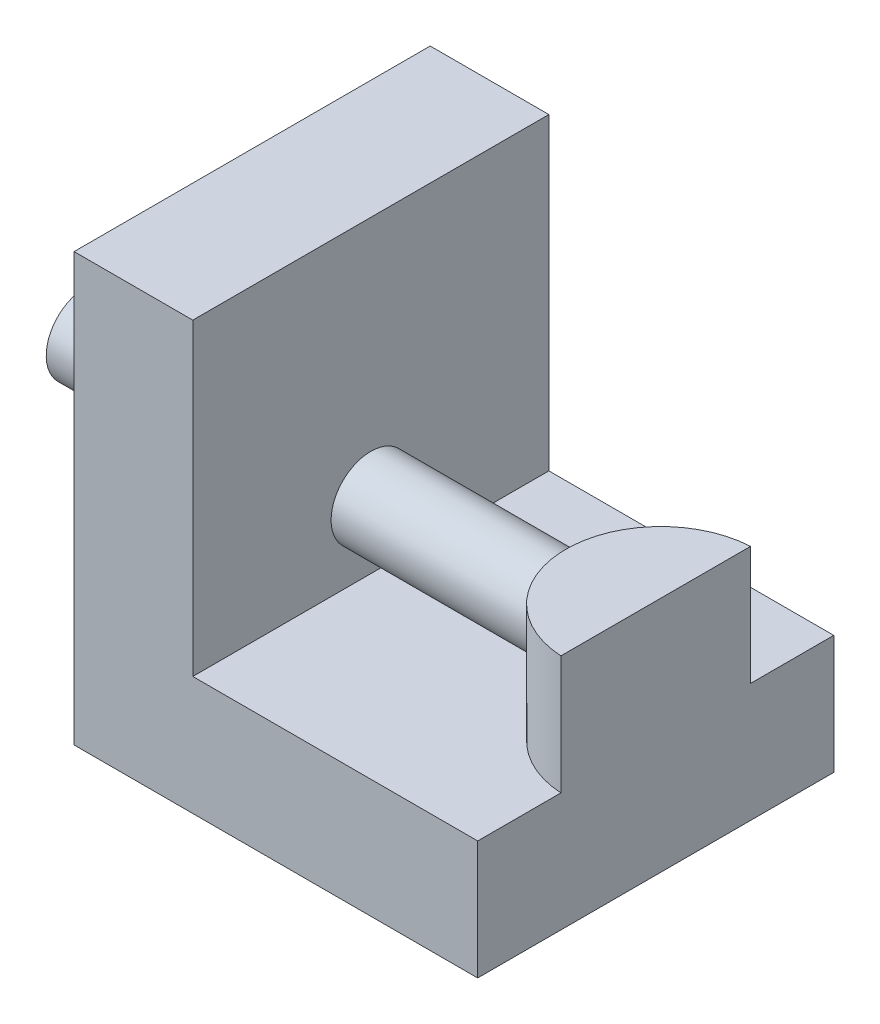
ISO-10303-21;
HEADER;
FILE_DESCRIPTION(('STEP AP214'),'2;1');
FILE_NAME('part.step','',(''),(''),'','','');
FILE_SCHEMA(('AUTOMOTIVE_DESIGN { 1 0 10303 214 1 1 1 1 }'));
ENDSEC;
DATA;
#1=APPLICATION_CONTEXT('core data for automotive mechanical design processes');
#2=APPLICATION_PROTOCOL_DEFINITION('international standard','automotive_design',2000,#1);
#3=PRODUCT_CONTEXT('',#1,'mechanical');
#4=PRODUCT('Part','Part','',(#3));
#5=PRODUCT_RELATED_PRODUCT_CATEGORY('part','',(#4));
#6=PRODUCT_DEFINITION_FORMATION('','',#4);
#7=PRODUCT_DEFINITION_CONTEXT('part definition',#1,'design');
#8=PRODUCT_DEFINITION('design','',#6,#7);
#9=PRODUCT_DEFINITION_SHAPE('','',#8);
#10=(LENGTH_UNIT() NAMED_UNIT(*) SI_UNIT(.MILLI.,.METRE.));
#11=(NAMED_UNIT(*) PLANE_ANGLE_UNIT() SI_UNIT($,.RADIAN.));
#12=(NAMED_UNIT(*) SI_UNIT($,.STERADIAN.) SOLID_ANGLE_UNIT());
#13=UNCERTAINTY_MEASURE_WITH_UNIT(LENGTH_MEASURE(1.E-05),#10,'distance_accuracy_value','');
#14=(GEOMETRIC_REPRESENTATION_CONTEXT(3) GLOBAL_UNCERTAINTY_ASSIGNED_CONTEXT((#13)) GLOBAL_UNIT_ASSIGNED_CONTEXT((#10,
#11,#12)) REPRESENTATION_CONTEXT('',''));
#15=CARTESIAN_POINT('',(0.,0.,0.));
#16=DIRECTION('',(0.,0.,1.));
#17=DIRECTION('',(1.,0.,0.));
#18=AXIS2_PLACEMENT_3D('',#15,#16,#17);
#19=CARTESIAN_POINT('',(10.,0.,15.));
#20=DIRECTION('',(0.,-1.,0.));
#21=DIRECTION('',(1.,0.,0.));
#22=AXIS2_PLACEMENT_3D('',#19,#20,#21);
#23=PLANE('',#22);
#24=DIRECTION('',(-1.,0.,0.));
#25=VECTOR('',#24,1.);
#26=CARTESIAN_POINT('',(10.,0.,-15.));
#27=LINE('',#26,#25);
#28=CARTESIAN_POINT('',(10.,0.,-15.));
#29=VERTEX_POINT('',#28);
#30=CARTESIAN_POINT('',(0.,0.,-15.));
#31=VERTEX_POINT('',#30);
#32=EDGE_CURVE('E143',#29,#31,#27,.T.);
#33=ORIENTED_EDGE('',*,*,#32,.T.);
#34=DIRECTION('',(0.,0.,-1.));
#35=VECTOR('',#34,1.);
#36=CARTESIAN_POINT('',(0.,0.,15.));
#37=LINE('',#36,#35);
#38=CARTESIAN_POINT('',(0.,0.,15.));
#39=VERTEX_POINT('',#38);
#40=EDGE_CURVE('E158',#39,#31,#37,.T.);
#41=ORIENTED_EDGE('',*,*,#40,.F.);
#42=DIRECTION('',(-1.,0.,0.));
#43=VECTOR('',#42,1.);
#44=CARTESIAN_POINT('',(10.,0.,15.));
#45=LINE('',#44,#43);
#46=CARTESIAN_POINT('',(10.,0.,15.));
#47=VERTEX_POINT('',#46);
#48=EDGE_CURVE('E137',#47,#39,#45,.T.);
#49=ORIENTED_EDGE('',*,*,#48,.F.);
#50=DIRECTION('',(0.,0.,-1.));
#51=VECTOR('',#50,1.);
#52=CARTESIAN_POINT('',(10.,0.,15.));
#53=LINE('',#52,#51);
#54=EDGE_CURVE('E142',#47,#29,#53,.T.);
#55=ORIENTED_EDGE('',*,*,#54,.T.);
#56=EDGE_LOOP('',(#33,#41,#49,#55));
#57=FACE_BOUND('',#56,.T.);
#58=ADVANCED_FACE('F41',(#57),#23,.F.);
#59=CARTESIAN_POINT('',(0.,0.,15.));
#60=DIRECTION('',(1.,0.,0.));
#61=DIRECTION('',(0.,0.,-1.));
#62=AXIS2_PLACEMENT_3D('',#59,#60,#61);
#63=PLANE('',#62);
#64=CARTESIAN_POINT('',(0.,-20.4235898195642,0.));
#65=DIRECTION('',(1.,0.,0.));
#66=DIRECTION('',(0.,0.,-1.));
#67=AXIS2_PLACEMENT_3D('',#64,#65,#66);
#68=CIRCLE('',#67,3.34939061710744);
#69=CARTESIAN_POINT('',(0.,-20.4235898195642,-3.34939061710744));
#70=VERTEX_POINT('',#69);
#71=EDGE_CURVE('E131',#70,#70,#68,.T.);
#72=ORIENTED_EDGE('',*,*,#71,.T.);
#73=EDGE_LOOP('',(#72));
#74=FACE_BOUND('',#73,.T.);
#75=DIRECTION('',(0.,-1.,0.));
#76=VECTOR('',#75,1.);
#77=CARTESIAN_POINT('',(0.,0.,-15.));
#78=LINE('',#77,#76);
#79=CARTESIAN_POINT('',(0.,-36.,-15.));
#80=VERTEX_POINT('',#79);
#81=EDGE_CURVE('E146',#31,#80,#78,.T.);
#82=ORIENTED_EDGE('',*,*,#81,.T.);
#83=DIRECTION('',(0.,0.,-1.));
#84=VECTOR('',#83,1.);
#85=CARTESIAN_POINT('',(0.,-36.,15.));
#86=LINE('',#85,#84);
#87=CARTESIAN_POINT('',(0.,-36.,15.));
#88=VERTEX_POINT('',#87);
#89=EDGE_CURVE('E156',#88,#80,#86,.T.);
#90=ORIENTED_EDGE('',*,*,#89,.F.);
#91=DIRECTION('',(0.,-1.,0.));
#92=VECTOR('',#91,1.);
#93=CARTESIAN_POINT('',(0.,0.,15.));
#94=LINE('',#93,#92);
#95=EDGE_CURVE('E92',#39,#88,#94,.T.);
#96=ORIENTED_EDGE('',*,*,#95,.F.);
#97=ORIENTED_EDGE('',*,*,#40,.T.);
#98=EDGE_LOOP('',(#82,#90,#96,#97));
#99=FACE_BOUND('',#98,.T.);
#100=ADVANCED_FACE('F181',(#74,#99),#63,.F.);
#101=CARTESIAN_POINT('',(0.,-36.,15.));
#102=DIRECTION('',(0.,1.,0.));
#103=DIRECTION('',(0.,0.,1.));
#104=AXIS2_PLACEMENT_3D('',#101,#102,#103);
#105=PLANE('',#104);
#106=DIRECTION('',(1.,0.,0.));
#107=VECTOR('',#106,1.);
#108=CARTESIAN_POINT('',(0.,-36.,-15.));
#109=LINE('',#108,#107);
#110=CARTESIAN_POINT('',(34.0028756214869,-36.,-15.));
#111=VERTEX_POINT('',#110);
#112=EDGE_CURVE('E130',#80,#111,#109,.T.);
#113=ORIENTED_EDGE('',*,*,#112,.T.);
#114=DIRECTION('',(0.,0.,1.));
#115=VECTOR('',#114,1.);
#116=CARTESIAN_POINT('',(34.0028756214869,-36.,-15.));
#117=LINE('',#116,#115);
#118=CARTESIAN_POINT('',(34.0028756214869,-36.,15.));
#119=VERTEX_POINT('',#118);
#120=EDGE_CURVE('E115',#111,#119,#117,.T.);
#121=ORIENTED_EDGE('',*,*,#120,.T.);
#122=DIRECTION('',(1.,0.,0.));
#123=VECTOR('',#122,1.);
#124=CARTESIAN_POINT('',(0.,-36.,15.));
#125=LINE('',#124,#123);
#126=EDGE_CURVE('E128',#88,#119,#125,.T.);
#127=ORIENTED_EDGE('',*,*,#126,.F.);
#128=ORIENTED_EDGE('',*,*,#89,.T.);
#129=EDGE_LOOP('',(#113,#121,#127,#128));
#130=FACE_BOUND('',#129,.T.);
#131=ADVANCED_FACE('F126',(#130),#105,.F.);
#132=CARTESIAN_POINT('',(60.,-26.,15.));
#133=DIRECTION('',(0.,-1.,0.));
#134=DIRECTION('',(1.,0.,0.));
#135=AXIS2_PLACEMENT_3D('',#132,#133,#134);
#136=PLANE('',#135);
#137=DIRECTION('',(-1.,0.,0.));
#138=VECTOR('',#137,1.);
#139=CARTESIAN_POINT('',(60.,-26.,15.));
#140=LINE('',#139,#138);
#141=CARTESIAN_POINT('',(34.0028756214869,-26.,15.));
#142=VERTEX_POINT('',#141);
#143=CARTESIAN_POINT('',(10.,-26.,15.));
#144=VERTEX_POINT('',#143);
#145=EDGE_CURVE('E134',#142,#144,#140,.T.);
#146=ORIENTED_EDGE('',*,*,#145,.F.);
#147=DIRECTION('',(0.,0.,-1.));
#148=VECTOR('',#147,1.);
#149=CARTESIAN_POINT('',(34.0028756214869,-26.,15.));
#150=LINE('',#149,#148);
#151=CARTESIAN_POINT('',(34.0028756214869,-26.,7.98849562483435));
#152=VERTEX_POINT('',#151);
#153=EDGE_CURVE('E118',#142,#152,#150,.T.);
#154=ORIENTED_EDGE('',*,*,#153,.T.);
#155=CARTESIAN_POINT('',(34.4317551523605,-26.,0.));
#156=DIRECTION('',(0.,-1.,0.));
#157=DIRECTION('',(1.,0.,0.));
#158=AXIS2_PLACEMENT_3D('',#155,#156,#157);
#159=CIRCLE('',#158,8.);
#160=CARTESIAN_POINT('',(34.0028756214869,-26.,-7.98849562483435));
#161=VERTEX_POINT('',#160);
#162=EDGE_CURVE('E48',#161,#152,#159,.F.);
#163=ORIENTED_EDGE('',*,*,#162,.F.);
#164=CARTESIAN_POINT('',(34.0028756214869,-26.,-15.));
#165=VERTEX_POINT('',#164);
#166=EDGE_CURVE('E170',#161,#165,#150,.T.);
#167=ORIENTED_EDGE('',*,*,#166,.T.);
#168=DIRECTION('',(-1.,0.,0.));
#169=VECTOR('',#168,1.);
#170=CARTESIAN_POINT('',(60.,-26.,-15.));
#171=LINE('',#170,#169);
#172=CARTESIAN_POINT('',(10.,-26.,-15.));
#173=VERTEX_POINT('',#172);
#174=EDGE_CURVE('E150',#165,#173,#171,.T.);
#175=ORIENTED_EDGE('',*,*,#174,.T.);
#176=DIRECTION('',(0.,0.,-1.));
#177=VECTOR('',#176,1.);
#178=CARTESIAN_POINT('',(10.,-26.,15.));
#179=LINE('',#178,#177);
#180=EDGE_CURVE('E154',#144,#173,#179,.T.);
#181=ORIENTED_EDGE('',*,*,#180,.F.);
#182=EDGE_LOOP('',(#146,#154,#163,#167,#175,#181));
#183=FACE_BOUND('',#182,.T.);
#184=ADVANCED_FACE('F169',(#183),#136,.F.);
#185=CARTESIAN_POINT('',(10.,-26.,15.));
#186=DIRECTION('',(-1.,0.,0.));
#187=DIRECTION('',(0.,-1.,0.));
#188=AXIS2_PLACEMENT_3D('',#185,#186,#187);
#189=PLANE('',#188);
#190=CARTESIAN_POINT('',(10.,-20.4235898195642,0.));
#191=DIRECTION('',(-1.,0.,0.));
#192=DIRECTION('',(0.,-1.,0.));
#193=AXIS2_PLACEMENT_3D('',#190,#191,#192);
#194=CIRCLE('',#193,3.34939061710744);
#195=CARTESIAN_POINT('',(10.,-23.7729804366716,0.));
#196=VERTEX_POINT('',#195);
#197=EDGE_CURVE('E188',#196,#196,#194,.T.);
#198=ORIENTED_EDGE('',*,*,#197,.T.);
#199=EDGE_LOOP('',(#198));
#200=FACE_BOUND('',#199,.T.);
#201=DIRECTION('',(0.,1.,0.));
#202=VECTOR('',#201,1.);
#203=CARTESIAN_POINT('',(10.,-26.,-15.));
#204=LINE('',#203,#202);
#205=EDGE_CURVE('E84',#173,#29,#204,.T.);
#206=ORIENTED_EDGE('',*,*,#205,.T.);
#207=ORIENTED_EDGE('',*,*,#54,.F.);
#208=DIRECTION('',(0.,1.,0.));
#209=VECTOR('',#208,1.);
#210=CARTESIAN_POINT('',(10.,-26.,15.));
#211=LINE('',#210,#209);
#212=EDGE_CURVE('E63',#144,#47,#211,.T.);
#213=ORIENTED_EDGE('',*,*,#212,.F.);
#214=ORIENTED_EDGE('',*,*,#180,.T.);
#215=EDGE_LOOP('',(#206,#207,#213,#214));
#216=FACE_BOUND('',#215,.T.);
#217=ADVANCED_FACE('F231',(#200,#216),#189,.F.);
#218=CARTESIAN_POINT('',(0.,0.,15.));
#219=DIRECTION('',(0.,0.,1.));
#220=DIRECTION('',(1.,0.,0.));
#221=AXIS2_PLACEMENT_3D('',#218,#219,#220);
#222=PLANE('',#221);
#223=DIRECTION('',(0.,1.,0.));
#224=VECTOR('',#223,1.);
#225=CARTESIAN_POINT('',(34.0028756214869,-36.,15.));
#226=LINE('',#225,#224);
#227=EDGE_CURVE('E112',#119,#142,#226,.T.);
#228=ORIENTED_EDGE('',*,*,#227,.T.);
#229=ORIENTED_EDGE('',*,*,#145,.T.);
#230=ORIENTED_EDGE('',*,*,#212,.T.);
#231=ORIENTED_EDGE('',*,*,#48,.T.);
#232=ORIENTED_EDGE('',*,*,#95,.T.);
#233=ORIENTED_EDGE('',*,*,#126,.T.);
#234=EDGE_LOOP('',(#228,#229,#230,#231,#232,#233));
#235=FACE_BOUND('',#234,.T.);
#236=ADVANCED_FACE('F133',(#235),#222,.T.);
#237=CARTESIAN_POINT('',(0.,0.,-15.));
#238=DIRECTION('',(0.,0.,1.));
#239=DIRECTION('',(1.,0.,0.));
#240=AXIS2_PLACEMENT_3D('',#237,#238,#239);
#241=PLANE('',#240);
#242=ORIENTED_EDGE('',*,*,#174,.F.);
#243=DIRECTION('',(0.,1.,0.));
#244=VECTOR('',#243,1.);
#245=CARTESIAN_POINT('',(34.0028756214869,-36.,-15.));
#246=LINE('',#245,#244);
#247=EDGE_CURVE('E121',#111,#165,#246,.T.);
#248=ORIENTED_EDGE('',*,*,#247,.F.);
#249=ORIENTED_EDGE('',*,*,#112,.F.);
#250=ORIENTED_EDGE('',*,*,#81,.F.);
#251=ORIENTED_EDGE('',*,*,#32,.F.);
#252=ORIENTED_EDGE('',*,*,#205,.F.);
#253=EDGE_LOOP('',(#242,#248,#249,#250,#251,#252));
#254=FACE_BOUND('',#253,.T.);
#255=ADVANCED_FACE('F183',(#254),#241,.F.);
#256=CARTESIAN_POINT('',(34.4317551523605,-16.,0.));
#257=DIRECTION('',(0.,-1.,0.));
#258=DIRECTION('',(1.,0.,0.));
#259=AXIS2_PLACEMENT_3D('',#256,#257,#258);
#260=CYLINDRICAL_SURFACE('',#259,8.);
#261=CARTESIAN_POINT('',(26.4317551523605,-17.0741992024567,0.));
#262=CARTESIAN_POINT('',(26.4317558817988,-17.0742001925388,0.0897078127797531));
#263=CARTESIAN_POINT('',(26.4332697400993,-17.0778105669251,0.17944977003199));
#264=CARTESIAN_POINT('',(26.4392788678862,-17.0922045543725,0.35827139459629));
#265=CARTESIAN_POINT('',(26.443776011113,-17.1029926756425,0.447350610074309));
#266=CARTESIAN_POINT('',(26.4616182759959,-17.1460527800052,0.712944928938162));
#267=CARTESIAN_POINT('',(26.4793138087965,-17.1890201788916,0.887573114557001));
#268=CARTESIAN_POINT('',(26.5243947874883,-17.3015109309302,1.22588125103088));
#269=CARTESIAN_POINT('',(26.5517472557409,-17.3709439695709,1.38959623536702));
#270=CARTESIAN_POINT('',(26.6134746962865,-17.5340199859777,1.70293392598224));
#271=CARTESIAN_POINT('',(26.6478475785189,-17.6276557605,1.85256080713196));
#272=CARTESIAN_POINT('',(26.7221270010987,-17.8414815930732,2.14123413851876));
#273=CARTESIAN_POINT('',(26.762215902194,-17.9626991505073,2.27947165123353));
#274=CARTESIAN_POINT('',(26.8426222512165,-18.2260745560622,2.53435470737511));
#275=CARTESIAN_POINT('',(26.8829398089089,-18.3682434569073,2.65098878032265));
#276=CARTESIAN_POINT('',(26.9614858466184,-18.6780648792498,2.86509038356292));
#277=CARTESIAN_POINT('',(26.9995103662429,-18.8466337802149,2.96131448979058));
#278=CARTESIAN_POINT('',(27.0662696099118,-19.1993866345087,3.12368157207278));
#279=CARTESIAN_POINT('',(27.0950091630204,-19.3835624076593,3.18984019233904));
#280=CARTESIAN_POINT('',(27.1379690140483,-19.7529951491295,3.28685135135143));
#281=CARTESIAN_POINT('',(27.1528259158831,-19.9377664154364,3.31926066921861));
#282=CARTESIAN_POINT('',(27.1681668491843,-20.3106757985118,3.35270932232995));
#283=CARTESIAN_POINT('',(27.1686589173742,-20.4988119737481,3.35376619839562));
#284=CARTESIAN_POINT('',(27.1557528266048,-20.8575343576752,3.32565168307137));
#285=CARTESIAN_POINT('',(27.1434287803555,-21.0283502117384,3.29881788725265));
#286=CARTESIAN_POINT('',(27.108095727197,-21.3627850525175,3.21960761707694));
#287=CARTESIAN_POINT('',(27.0850846507318,-21.5264026385591,3.16722619529389));
#288=CARTESIAN_POINT('',(27.0304491959267,-21.8459488359237,3.03738428541276));
#289=CARTESIAN_POINT('',(26.9986512113858,-22.0016383200194,2.95941163366398));
#290=CARTESIAN_POINT('',(26.9300642240295,-22.2983326312061,2.78096311010722));
#291=CARTESIAN_POINT('',(26.8932732445743,-22.4393316033025,2.6804783158286));
#292=CARTESIAN_POINT('',(26.815023499484,-22.7153169800342,2.44978451019657));
#293=CARTESIAN_POINT('',(26.7734344373312,-22.8487613985906,2.31776982527865));
#294=CARTESIAN_POINT('',(26.6929233541248,-23.0921374660822,2.03282720016631));
#295=CARTESIAN_POINT('',(26.6540019713549,-23.2020635011343,1.87989428099903));
#296=CARTESIAN_POINT('',(26.5820616266107,-23.3975735149856,1.55273191159095));
#297=CARTESIAN_POINT('',(26.5492029330737,-23.4825244922825,1.37808632743886));
#298=CARTESIAN_POINT('',(26.4943227400624,-23.621298314138,1.0152557622637));
#299=CARTESIAN_POINT('',(26.4722951928913,-23.6751385326998,0.827078404302713));
#300=CARTESIAN_POINT('',(26.4426923266028,-23.7469216916627,0.455407187604107));
#301=CARTESIAN_POINT('',(26.4342854528807,-23.7669336411897,0.272379099880391));
#302=CARTESIAN_POINT('',(26.4302125689918,-23.7766677322842,-0.0945983537981081));
#303=CARTESIAN_POINT('',(26.4345428558972,-23.7663986770968,-0.2785474364808));
#304=CARTESIAN_POINT('',(26.4549191245146,-23.7173383328191,-0.632417932511072));
#305=CARTESIAN_POINT('',(26.4703659246182,-23.6800050818177,-0.802579924169701));
#306=CARTESIAN_POINT('',(26.5107793893392,-23.5799109248268,-1.13403627632087));
#307=CARTESIAN_POINT('',(26.5357472537752,-23.517146814047,-1.29532951626513));
#308=CARTESIAN_POINT('',(26.593777404959,-23.3659236714714,-1.61013446341021));
#309=CARTESIAN_POINT('',(26.6270672929311,-23.2767261875408,-1.76324812276608));
#310=CARTESIAN_POINT('',(26.6981953073113,-23.0759790161269,-2.05288320423365));
#311=CARTESIAN_POINT('',(26.7360353378966,-22.9644199574901,-2.18939763137508));
#312=CARTESIAN_POINT('',(26.8155632927109,-22.7127054704125,-2.45231037316896));
#313=CARTESIAN_POINT('',(26.8573319019693,-22.5710678617804,-2.57726891544397));
#314=CARTESIAN_POINT('',(26.9375715357592,-22.2681767696774,-2.80205140625325));
#315=CARTESIAN_POINT('',(26.9760417829382,-22.1069186836286,-2.9018694403947));
#316=CARTESIAN_POINT('',(27.0456042645346,-21.7659193573367,-3.07467374348574));
#317=CARTESIAN_POINT('',(27.0765785276364,-21.585939325015,-3.14723981342553));
#318=CARTESIAN_POINT('',(27.1260321162576,-21.2146089749996,-3.26041350211892));
#319=CARTESIAN_POINT('',(27.1445218773299,-21.0232682993757,-3.30104781667359));
#320=CARTESIAN_POINT('',(27.1653088587262,-20.650640046463,-3.34653944645754));
#321=CARTESIAN_POINT('',(27.1687508431016,-20.4697239134726,-3.3539274018473));
#322=CARTESIAN_POINT('',(27.1620990315104,-20.1093340998214,-3.33948583971582));
#323=CARTESIAN_POINT('',(27.1520073622613,-19.9298601969825,-3.31766091279254));
#324=CARTESIAN_POINT('',(27.1204759561348,-19.5862299243544,-3.24754585216849));
#325=CARTESIAN_POINT('',(27.0995974520697,-19.4217508299166,-3.20056073711527));
#326=CARTESIAN_POINT('',(27.0492903123863,-19.1029761096712,-3.08274122065387));
#327=CARTESIAN_POINT('',(27.0198592697859,-18.9486833656793,-3.01190010444373));
#328=CARTESIAN_POINT('',(26.953557755093,-18.644479135714,-2.84345192987509));
#329=CARTESIAN_POINT('',(26.9163451103826,-18.49539634989,-2.74448570951738));
#330=CARTESIAN_POINT('',(26.8396179740621,-18.2151599005261,-2.52448164410009));
#331=CARTESIAN_POINT('',(26.8001026753137,-18.084012578388,-2.40343602759855));
#332=CARTESIAN_POINT('',(26.7197215582408,-17.8334159656872,-2.13213428875183));
#333=CARTESIAN_POINT('',(26.6789714509354,-17.7155453958333,-1.98038128987496));
#334=CARTESIAN_POINT('',(26.6036264170432,-17.5068229215503,-1.65763569088373));
#335=CARTESIAN_POINT('',(26.5690342941532,-17.4159833115942,-1.48663438466082));
#336=CARTESIAN_POINT('',(26.5249507926865,-17.3031541227055,-1.22082506503175));
#337=CARTESIAN_POINT('',(26.5116302044379,-17.2696194637571,-1.13139141668865));
#338=CARTESIAN_POINT('',(26.4877941664912,-17.2102300809608,-0.949660603185164));
#339=CARTESIAN_POINT('',(26.4772773850246,-17.1843717103194,-0.85736482083741));
#340=CARTESIAN_POINT('',(26.459382519387,-17.1406737946855,-0.670848642616789));
#341=CARTESIAN_POINT('',(26.4519967031024,-17.1228144892535,-0.576633597343808));
#342=CARTESIAN_POINT('',(26.4405502917185,-17.095237072445,-0.386865739313124));
#343=CARTESIAN_POINT('',(26.4364872651262,-17.0855130078839,-0.291313956902217));
#344=CARTESIAN_POINT('',(26.4333488369869,-17.0780072921175,-0.162971475344952));
#345=CARTESIAN_POINT('',(26.4327515575874,-17.0765796891888,-0.130397697688395));
#346=CARTESIAN_POINT('',(26.4319545820193,-17.0746754627949,-0.0652174508253028));
#347=CARTESIAN_POINT('',(26.4317548871918,-17.0741988425377,-0.0326109815088623));
#348=CARTESIAN_POINT('',(26.4317551523605,-17.0741992024567,0.));
#349=B_SPLINE_CURVE_WITH_KNOTS('',3,(#261,#262,#263,#264,#265,#266,#267,#268,#269,#270,#271,
#272,#273,#274,#275,#276,#277,#278,#279,#280,#281,#282,#283,#284,#285,#286,#287,#288,#289,#290,
#291,#292,#293,#294,#295,#296,#297,#298,#299,#300,#301,#302,#303,#304,#305,#306,#307,#308,#309,
#310,#311,#312,#313,#314,#315,#316,#317,#318,#319,#320,#321,#322,#323,#324,#325,#326,#327,#328,
#329,#330,#331,#332,#333,#334,#335,#336,#337,#338,#339,#340,#341,#342,#343,#344,#345,#346,#347,
#348),.UNSPECIFIED.,.T.,.F.,(4,2,2,2,2,2,2,2,2,2,2,2,2,2,2,2,2,2,2,2,2,2,2,2,2,2,2,2,2,2,2,2,2,
2,2,2,2,2,2,2,2,2,2,4),(0.,0.269087516318143,0.538344201230814,1.07757862976634,
1.61498915021111,2.15223990977094,2.71432820545578,3.27671409518917,3.86710082932863,
4.45718001014136,5.01863921128206,5.57978428564602,6.0974172352987,6.61515046699729,
7.14395095351415,7.67296139695109,8.24715257976082,8.82148067056196,9.40931046414837,
9.99681166234412,10.5468724546635,11.0967733499577,11.6190628284677,12.1414181462406,
12.6800198210765,13.2188476835351,13.7965384618491,14.3743650172721,14.9607671612517,
15.5466785342506,16.0871423671981,16.6275212800445,17.1422572117362,17.6571381485696,
18.2031444465256,18.7493432983463,19.3358713201328,19.9226657057304,20.2116619045297,
20.5005205886626,20.7886617028211,21.0765917769566,21.1744113329843,21.2722312189786),.UNSPECIFIED.);
#350=CARTESIAN_POINT('',(26.4317551523605,-17.0741992024567,0.));
#351=VERTEX_POINT('',#350);
#352=EDGE_CURVE('E191',#351,#351,#349,.T.);
#353=ORIENTED_EDGE('',*,*,#352,.T.);
#354=EDGE_LOOP('',(#353));
#355=FACE_BOUND('',#354,.T.);
#356=CARTESIAN_POINT('',(34.4317551523605,-16.,0.));
#357=DIRECTION('',(0.,1.,0.));
#358=DIRECTION('',(-1.,0.,0.));
#359=AXIS2_PLACEMENT_3D('',#356,#357,#358);
#360=CIRCLE('',#359,8.);
#361=CARTESIAN_POINT('',(34.0028756214869,-16.,-7.98849562483435));
#362=VERTEX_POINT('',#361);
#363=CARTESIAN_POINT('',(34.0028756214869,-16.,7.98849562483435));
#364=VERTEX_POINT('',#363);
#365=EDGE_CURVE('E147',#362,#364,#360,.T.);
#366=ORIENTED_EDGE('',*,*,#365,.F.);
#367=DIRECTION('',(0.,-1.,0.));
#368=VECTOR('',#367,1.);
#369=CARTESIAN_POINT('',(34.0028756214869,-16.,-7.98849562483435));
#370=LINE('',#369,#368);
#371=EDGE_CURVE('E54',#362,#161,#370,.T.);
#372=ORIENTED_EDGE('',*,*,#371,.T.);
#373=ORIENTED_EDGE('',*,*,#162,.T.);
#374=DIRECTION('',(0.,-1.,0.));
#375=VECTOR('',#374,1.);
#376=CARTESIAN_POINT('',(34.0028756214869,-16.,7.98849562483435));
#377=LINE('',#376,#375);
#378=EDGE_CURVE('E165',#152,#364,#377,.F.);
#379=ORIENTED_EDGE('',*,*,#378,.T.);
#380=EDGE_LOOP('',(#366,#372,#373,#379));
#381=FACE_BOUND('',#380,.T.);
#382=ADVANCED_FACE('F164',(#355,#381),#260,.T.);
#383=CARTESIAN_POINT('',(34.4317551523605,-16.,0.));
#384=DIRECTION('',(0.,1.,0.));
#385=DIRECTION('',(-1.,0.,0.));
#386=AXIS2_PLACEMENT_3D('',#383,#384,#385);
#387=PLANE('',#386);
#388=DIRECTION('',(0.,0.,1.));
#389=VECTOR('',#388,1.);
#390=CARTESIAN_POINT('',(34.0028756214869,-16.,0.));
#391=LINE('',#390,#389);
#392=EDGE_CURVE('E11',#362,#364,#391,.T.);
#393=ORIENTED_EDGE('',*,*,#392,.F.);
#394=ORIENTED_EDGE('',*,*,#365,.T.);
#395=EDGE_LOOP('',(#393,#394));
#396=FACE_BOUND('',#395,.T.);
#397=ADVANCED_FACE('F212',(#396),#387,.T.);
#398=CARTESIAN_POINT('',(34.0028756214869,-36.,-15.));
#399=DIRECTION('',(-1.,0.,0.));
#400=DIRECTION('',(0.,-1.,0.));
#401=AXIS2_PLACEMENT_3D('',#398,#399,#400);
#402=PLANE('',#401);
#403=ORIENTED_EDGE('',*,*,#227,.F.);
#404=ORIENTED_EDGE('',*,*,#120,.F.);
#405=ORIENTED_EDGE('',*,*,#247,.T.);
#406=ORIENTED_EDGE('',*,*,#166,.F.);
#407=ORIENTED_EDGE('',*,*,#371,.F.);
#408=ORIENTED_EDGE('',*,*,#392,.T.);
#409=ORIENTED_EDGE('',*,*,#378,.F.);
#410=ORIENTED_EDGE('',*,*,#153,.F.);
#411=EDGE_LOOP('',(#403,#404,#405,#406,#407,#408,#409,#410));
#412=FACE_BOUND('',#411,.T.);
#413=ADVANCED_FACE('F114',(#412),#402,.F.);
#414=CARTESIAN_POINT('',(-14.,-20.4235898195642,0.));
#415=DIRECTION('',(1.,0.,0.));
#416=DIRECTION('',(0.,1.,0.));
#417=AXIS2_PLACEMENT_3D('',#414,#415,#416);
#418=CYLINDRICAL_SURFACE('',#417,3.34939061710744);
#419=ORIENTED_EDGE('',*,*,#352,.F.);
#420=EDGE_LOOP('',(#419));
#421=FACE_BOUND('',#420,.T.);
#422=ORIENTED_EDGE('',*,*,#197,.F.);
#423=EDGE_LOOP('',(#422));
#424=FACE_BOUND('',#423,.T.);
#425=ADVANCED_FACE('F209',(#421,#424),#418,.T.);
#426=CARTESIAN_POINT('',(-14.,-20.4235898195642,0.));
#427=DIRECTION('',(1.,0.,0.));
#428=DIRECTION('',(0.,1.,0.));
#429=AXIS2_PLACEMENT_3D('',#426,#427,#428);
#430=CIRCLE('',#429,3.34939061710744);
#431=CARTESIAN_POINT('',(-14.,-17.0741992024567,0.));
#432=VERTEX_POINT('',#431);
#433=EDGE_CURVE('E199',#432,#432,#430,.T.);
#434=ORIENTED_EDGE('',*,*,#433,.T.);
#435=EDGE_LOOP('',(#434));
#436=FACE_BOUND('',#435,.T.);
#437=ORIENTED_EDGE('',*,*,#71,.F.);
#438=EDGE_LOOP('',(#437));
#439=FACE_BOUND('',#438,.T.);
#440=ADVANCED_FACE('F203',(#436,#439),#418,.T.);
#441=CARTESIAN_POINT('',(-14.,-20.4235898195642,0.));
#442=DIRECTION('',(1.,0.,0.));
#443=DIRECTION('',(0.,1.,0.));
#444=AXIS2_PLACEMENT_3D('',#441,#442,#443);
#445=PLANE('',#444);
#446=ORIENTED_EDGE('',*,*,#433,.F.);
#447=EDGE_LOOP('',(#446));
#448=FACE_BOUND('',#447,.T.);
#449=ADVANCED_FACE('F208',(#448),#445,.F.);
#450=CLOSED_SHELL('',(#58,#100,#131,#184,#217,#236,#255,#382,#397,#413,#425,#440,#449));
#451=MANIFOLD_SOLID_BREP('B2',#450);
#452=ADVANCED_BREP_SHAPE_REPRESENTATION('',(#18,#451),#14);
#453=SHAPE_DEFINITION_REPRESENTATION(#9,#452);
ENDSEC;
END-ISO-10303-21;
